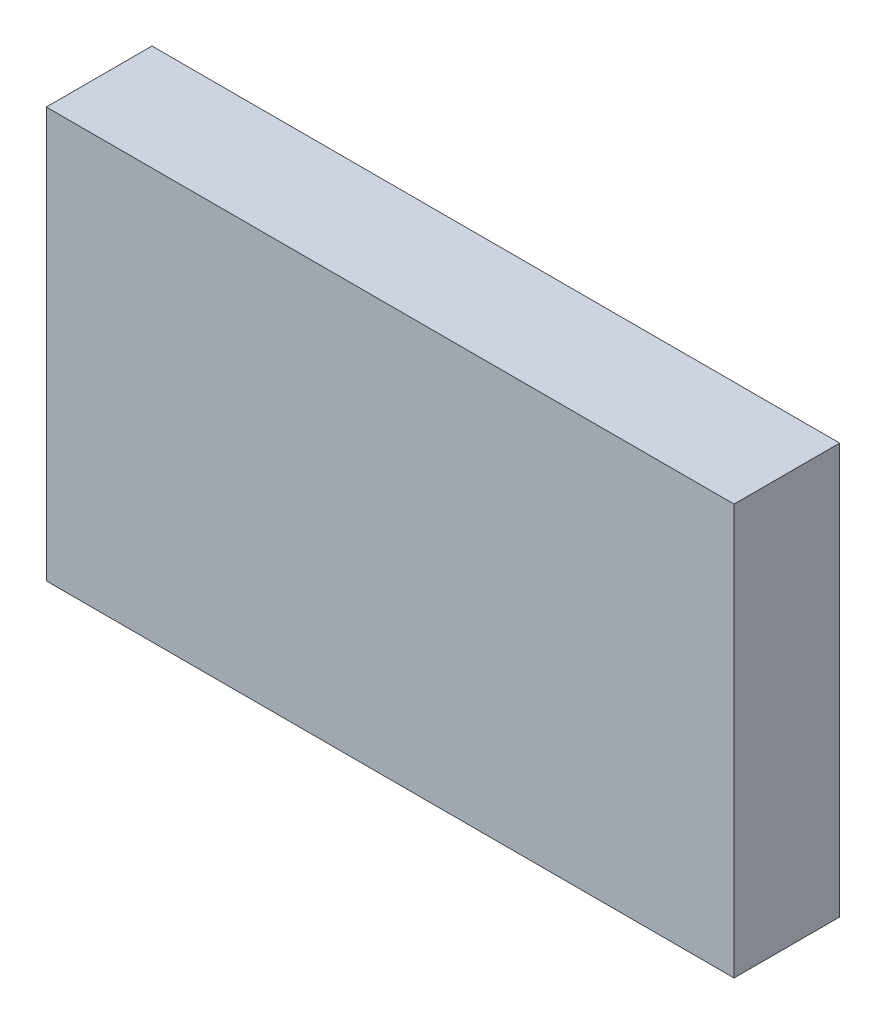
ISO-10303-21;
HEADER;
FILE_DESCRIPTION(('STEP AP214'),'2;1');
FILE_NAME('part.step','',(''),(''),'','','');
FILE_SCHEMA(('AUTOMOTIVE_DESIGN { 1 0 10303 214 1 1 1 1 }'));
ENDSEC;
DATA;
#1=APPLICATION_CONTEXT('core data for automotive mechanical design processes');
#2=APPLICATION_PROTOCOL_DEFINITION('international standard','automotive_design',2000,#1);
#3=PRODUCT_CONTEXT('',#1,'mechanical');
#4=PRODUCT('Part','Part','',(#3));
#5=PRODUCT_RELATED_PRODUCT_CATEGORY('part','',(#4));
#6=PRODUCT_DEFINITION_FORMATION('','',#4);
#7=PRODUCT_DEFINITION_CONTEXT('part definition',#1,'design');
#8=PRODUCT_DEFINITION('design','',#6,#7);
#9=PRODUCT_DEFINITION_SHAPE('','',#8);
#10=(LENGTH_UNIT() NAMED_UNIT(*) SI_UNIT(.MILLI.,.METRE.));
#11=(NAMED_UNIT(*) PLANE_ANGLE_UNIT() SI_UNIT($,.RADIAN.));
#12=(NAMED_UNIT(*) SI_UNIT($,.STERADIAN.) SOLID_ANGLE_UNIT());
#13=UNCERTAINTY_MEASURE_WITH_UNIT(LENGTH_MEASURE(1.E-05),#10,'distance_accuracy_value','');
#14=(GEOMETRIC_REPRESENTATION_CONTEXT(3) GLOBAL_UNCERTAINTY_ASSIGNED_CONTEXT((#13)) GLOBAL_UNIT_ASSIGNED_CONTEXT((#10,
#11,#12)) REPRESENTATION_CONTEXT('',''));
#15=CARTESIAN_POINT('',(0.,0.,0.));
#16=DIRECTION('',(0.,0.,1.));
#17=DIRECTION('',(1.,0.,0.));
#18=AXIS2_PLACEMENT_3D('',#15,#16,#17);
#19=CARTESIAN_POINT('',(15.5,9.25,4.7625));
#20=DIRECTION('',(-1.,0.,0.));
#21=DIRECTION('',(0.,0.,1.));
#22=AXIS2_PLACEMENT_3D('',#19,#20,#21);
#23=PLANE('',#22);
#24=DIRECTION('',(0.,1.,0.));
#25=VECTOR('',#24,1.);
#26=CARTESIAN_POINT('',(15.5,9.25,0.));
#27=LINE('',#26,#25);
#28=CARTESIAN_POINT('',(15.5,-9.25,0.));
#29=VERTEX_POINT('',#28);
#30=CARTESIAN_POINT('',(15.5,9.25,0.));
#31=VERTEX_POINT('',#30);
#32=EDGE_CURVE('E95',#29,#31,#27,.T.);
#33=ORIENTED_EDGE('',*,*,#32,.T.);
#34=DIRECTION('',(0.,0.,-1.));
#35=VECTOR('',#34,1.);
#36=CARTESIAN_POINT('',(15.5,9.25,4.7625));
#37=LINE('',#36,#35);
#38=CARTESIAN_POINT('',(15.5,9.25,4.7625));
#39=VERTEX_POINT('',#38);
#40=EDGE_CURVE('E11',#39,#31,#37,.T.);
#41=ORIENTED_EDGE('',*,*,#40,.F.);
#42=DIRECTION('',(0.,1.,0.));
#43=VECTOR('',#42,1.);
#44=CARTESIAN_POINT('',(15.5,9.25,4.7625));
#45=LINE('',#44,#43);
#46=CARTESIAN_POINT('',(15.5,-9.25,4.7625));
#47=VERTEX_POINT('',#46);
#48=EDGE_CURVE('E83',#47,#39,#45,.T.);
#49=ORIENTED_EDGE('',*,*,#48,.F.);
#50=DIRECTION('',(0.,0.,-1.));
#51=VECTOR('',#50,1.);
#52=CARTESIAN_POINT('',(15.5,-9.25,4.7625));
#53=LINE('',#52,#51);
#54=EDGE_CURVE('E91',#47,#29,#53,.T.);
#55=ORIENTED_EDGE('',*,*,#54,.T.);
#56=EDGE_LOOP('',(#33,#41,#49,#55));
#57=FACE_BOUND('',#56,.T.);
#58=ADVANCED_FACE('F32',(#57),#23,.F.);
#59=CARTESIAN_POINT('',(-15.5,9.25,4.7625));
#60=DIRECTION('',(0.,-1.,0.));
#61=DIRECTION('',(0.,0.,-1.));
#62=AXIS2_PLACEMENT_3D('',#59,#60,#61);
#63=PLANE('',#62);
#64=DIRECTION('',(-1.,0.,0.));
#65=VECTOR('',#64,1.);
#66=CARTESIAN_POINT('',(-15.5,9.25,0.));
#67=LINE('',#66,#65);
#68=CARTESIAN_POINT('',(-15.5,9.25,0.));
#69=VERTEX_POINT('',#68);
#70=EDGE_CURVE('E87',#31,#69,#67,.T.);
#71=ORIENTED_EDGE('',*,*,#70,.T.);
#72=DIRECTION('',(0.,0.,-1.));
#73=VECTOR('',#72,1.);
#74=CARTESIAN_POINT('',(-15.5,9.25,4.7625));
#75=LINE('',#74,#73);
#76=CARTESIAN_POINT('',(-15.5,9.25,4.7625));
#77=VERTEX_POINT('',#76);
#78=EDGE_CURVE('E40',#77,#69,#75,.T.);
#79=ORIENTED_EDGE('',*,*,#78,.F.);
#80=DIRECTION('',(-1.,0.,0.));
#81=VECTOR('',#80,1.);
#82=CARTESIAN_POINT('',(-15.5,9.25,4.7625));
#83=LINE('',#82,#81);
#84=EDGE_CURVE('E78',#39,#77,#83,.T.);
#85=ORIENTED_EDGE('',*,*,#84,.F.);
#86=ORIENTED_EDGE('',*,*,#40,.T.);
#87=EDGE_LOOP('',(#71,#79,#85,#86));
#88=FACE_BOUND('',#87,.T.);
#89=ADVANCED_FACE('F86',(#88),#63,.F.);
#90=CARTESIAN_POINT('',(-15.5,9.25,4.7625));
#91=DIRECTION('',(1.,0.,0.));
#92=DIRECTION('',(0.,1.,0.));
#93=AXIS2_PLACEMENT_3D('',#90,#91,#92);
#94=PLANE('',#93);
#95=DIRECTION('',(0.,-1.,0.));
#96=VECTOR('',#95,1.);
#97=CARTESIAN_POINT('',(-15.5,9.25,0.));
#98=LINE('',#97,#96);
#99=CARTESIAN_POINT('',(-15.5,-9.25,0.));
#100=VERTEX_POINT('',#99);
#101=EDGE_CURVE('E65',#69,#100,#98,.T.);
#102=ORIENTED_EDGE('',*,*,#101,.T.);
#103=DIRECTION('',(0.,0.,-1.));
#104=VECTOR('',#103,1.);
#105=CARTESIAN_POINT('',(-15.5,-9.25,4.7625));
#106=LINE('',#105,#104);
#107=CARTESIAN_POINT('',(-15.5,-9.25,4.7625));
#108=VERTEX_POINT('',#107);
#109=EDGE_CURVE('E88',#108,#100,#106,.T.);
#110=ORIENTED_EDGE('',*,*,#109,.F.);
#111=DIRECTION('',(0.,-1.,0.));
#112=VECTOR('',#111,1.);
#113=CARTESIAN_POINT('',(-15.5,9.25,4.7625));
#114=LINE('',#113,#112);
#115=EDGE_CURVE('E81',#77,#108,#114,.T.);
#116=ORIENTED_EDGE('',*,*,#115,.F.);
#117=ORIENTED_EDGE('',*,*,#78,.T.);
#118=EDGE_LOOP('',(#102,#110,#116,#117));
#119=FACE_BOUND('',#118,.T.);
#120=ADVANCED_FACE('F89',(#119),#94,.F.);
#121=CARTESIAN_POINT('',(-15.5,-9.25,4.7625));
#122=DIRECTION('',(0.,1.,0.));
#123=DIRECTION('',(0.,0.,1.));
#124=AXIS2_PLACEMENT_3D('',#121,#122,#123);
#125=PLANE('',#124);
#126=DIRECTION('',(1.,0.,0.));
#127=VECTOR('',#126,1.);
#128=CARTESIAN_POINT('',(-15.5,-9.25,0.));
#129=LINE('',#128,#127);
#130=EDGE_CURVE('E71',#100,#29,#129,.T.);
#131=ORIENTED_EDGE('',*,*,#130,.T.);
#132=ORIENTED_EDGE('',*,*,#54,.F.);
#133=DIRECTION('',(1.,0.,0.));
#134=VECTOR('',#133,1.);
#135=CARTESIAN_POINT('',(-15.5,-9.25,4.7625));
#136=LINE('',#135,#134);
#137=EDGE_CURVE('E48',#108,#47,#136,.T.);
#138=ORIENTED_EDGE('',*,*,#137,.F.);
#139=ORIENTED_EDGE('',*,*,#109,.T.);
#140=EDGE_LOOP('',(#131,#132,#138,#139));
#141=FACE_BOUND('',#140,.T.);
#142=ADVANCED_FACE('F102',(#141),#125,.F.);
#143=CARTESIAN_POINT('',(0.,0.,4.7625));
#144=DIRECTION('',(0.,0.,1.));
#145=DIRECTION('',(1.,0.,0.));
#146=AXIS2_PLACEMENT_3D('',#143,#144,#145);
#147=PLANE('',#146);
#148=ORIENTED_EDGE('',*,*,#48,.T.);
#149=ORIENTED_EDGE('',*,*,#84,.T.);
#150=ORIENTED_EDGE('',*,*,#115,.T.);
#151=ORIENTED_EDGE('',*,*,#137,.T.);
#152=EDGE_LOOP('',(#148,#149,#150,#151));
#153=FACE_BOUND('',#152,.T.);
#154=ADVANCED_FACE('F79',(#153),#147,.T.);
#155=CARTESIAN_POINT('',(0.,0.,0.));
#156=DIRECTION('',(0.,0.,1.));
#157=DIRECTION('',(1.,0.,0.));
#158=AXIS2_PLACEMENT_3D('',#155,#156,#157);
#159=PLANE('',#158);
#160=ORIENTED_EDGE('',*,*,#32,.F.);
#161=ORIENTED_EDGE('',*,*,#130,.F.);
#162=ORIENTED_EDGE('',*,*,#101,.F.);
#163=ORIENTED_EDGE('',*,*,#70,.F.);
#164=EDGE_LOOP('',(#160,#161,#162,#163));
#165=FACE_BOUND('',#164,.T.);
#166=ADVANCED_FACE('F105',(#165),#159,.F.);
#167=CLOSED_SHELL('',(#58,#89,#120,#142,#154,#166));
#168=MANIFOLD_SOLID_BREP('B2',#167);
#169=ADVANCED_BREP_SHAPE_REPRESENTATION('',(#18,#168),#14);
#170=SHAPE_DEFINITION_REPRESENTATION(#9,#169);
ENDSEC;
END-ISO-10303-21;
